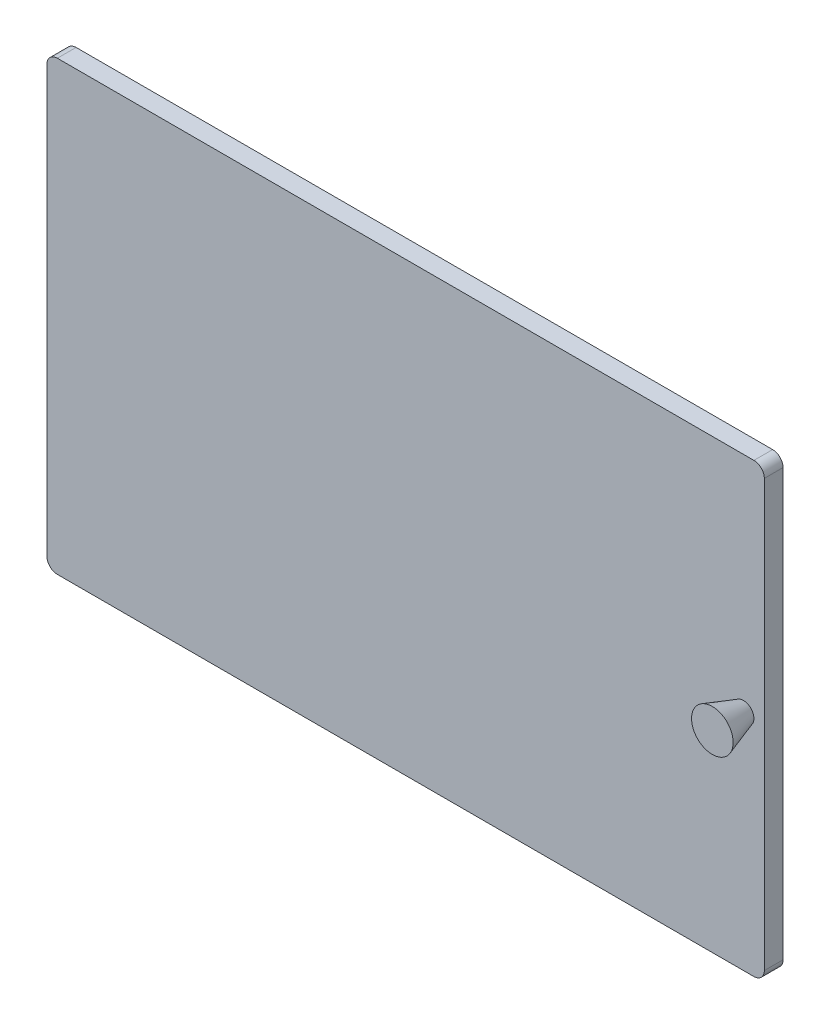
ISO-10303-21;
HEADER;
FILE_DESCRIPTION(('STEP AP214'),'2;1');
FILE_NAME('part.step','',(''),(''),'','','');
FILE_SCHEMA(('AUTOMOTIVE_DESIGN { 1 0 10303 214 1 1 1 1 }'));
ENDSEC;
DATA;
#1=APPLICATION_CONTEXT('core data for automotive mechanical design processes');
#2=APPLICATION_PROTOCOL_DEFINITION('international standard','automotive_design',2000,#1);
#3=PRODUCT_CONTEXT('',#1,'mechanical');
#4=PRODUCT('Part','Part','',(#3));
#5=PRODUCT_RELATED_PRODUCT_CATEGORY('part','',(#4));
#6=PRODUCT_DEFINITION_FORMATION('','',#4);
#7=PRODUCT_DEFINITION_CONTEXT('part definition',#1,'design');
#8=PRODUCT_DEFINITION('design','',#6,#7);
#9=PRODUCT_DEFINITION_SHAPE('','',#8);
#10=(LENGTH_UNIT() NAMED_UNIT(*) SI_UNIT(.MILLI.,.METRE.));
#11=(NAMED_UNIT(*) PLANE_ANGLE_UNIT() SI_UNIT($,.RADIAN.));
#12=(NAMED_UNIT(*) SI_UNIT($,.STERADIAN.) SOLID_ANGLE_UNIT());
#13=UNCERTAINTY_MEASURE_WITH_UNIT(LENGTH_MEASURE(1.E-05),#10,'distance_accuracy_value','');
#14=(GEOMETRIC_REPRESENTATION_CONTEXT(3) GLOBAL_UNCERTAINTY_ASSIGNED_CONTEXT((#13)) GLOBAL_UNIT_ASSIGNED_CONTEXT((#10,
#11,#12)) REPRESENTATION_CONTEXT('',''));
#15=CARTESIAN_POINT('',(0.,0.,0.));
#16=DIRECTION('',(0.,0.,1.));
#17=DIRECTION('',(1.,0.,0.));
#18=AXIS2_PLACEMENT_3D('',#15,#16,#17);
#19=CARTESIAN_POINT('',(33.5,-20.5,1.8));
#20=DIRECTION('',(0.,0.,-1.));
#21=DIRECTION('',(-1.,0.,0.));
#22=AXIS2_PLACEMENT_3D('',#19,#20,#21);
#23=CYLINDRICAL_SURFACE('',#22,1.);
#24=CARTESIAN_POINT('',(33.5,-20.5,0.));
#25=DIRECTION('',(0.,0.,1.));
#26=DIRECTION('',(1.,0.,0.));
#27=AXIS2_PLACEMENT_3D('',#24,#25,#26);
#28=CIRCLE('',#27,1.);
#29=CARTESIAN_POINT('',(33.5,-21.5,0.));
#30=VERTEX_POINT('',#29);
#31=CARTESIAN_POINT('',(34.5,-20.5,0.));
#32=VERTEX_POINT('',#31);
#33=EDGE_CURVE('E140',#30,#32,#28,.T.);
#34=ORIENTED_EDGE('',*,*,#33,.T.);
#35=DIRECTION('',(0.,0.,-1.));
#36=VECTOR('',#35,1.);
#37=CARTESIAN_POINT('',(34.5,-20.5,1.8));
#38=LINE('',#37,#36);
#39=CARTESIAN_POINT('',(34.5,-20.5,1.8));
#40=VERTEX_POINT('',#39);
#41=EDGE_CURVE('E11',#40,#32,#38,.T.);
#42=ORIENTED_EDGE('',*,*,#41,.F.);
#43=CARTESIAN_POINT('',(33.5,-20.5,1.8));
#44=DIRECTION('',(0.,0.,1.));
#45=DIRECTION('',(1.,0.,0.));
#46=AXIS2_PLACEMENT_3D('',#43,#44,#45);
#47=CIRCLE('',#46,1.);
#48=CARTESIAN_POINT('',(33.5,-21.5,1.8));
#49=VERTEX_POINT('',#48);
#50=EDGE_CURVE('E163',#49,#40,#47,.T.);
#51=ORIENTED_EDGE('',*,*,#50,.F.);
#52=DIRECTION('',(0.,0.,-1.));
#53=VECTOR('',#52,1.);
#54=CARTESIAN_POINT('',(33.5,-21.5,1.8));
#55=LINE('',#54,#53);
#56=EDGE_CURVE('E136',#49,#30,#55,.T.);
#57=ORIENTED_EDGE('',*,*,#56,.T.);
#58=EDGE_LOOP('',(#34,#42,#51,#57));
#59=FACE_BOUND('',#58,.T.);
#60=ADVANCED_FACE('F39',(#59),#23,.T.);
#61=CARTESIAN_POINT('',(34.5,-20.5,1.8));
#62=DIRECTION('',(-1.,0.,0.));
#63=DIRECTION('',(0.,0.,1.));
#64=AXIS2_PLACEMENT_3D('',#61,#62,#63);
#65=PLANE('',#64);
#66=DIRECTION('',(0.,1.,0.));
#67=VECTOR('',#66,1.);
#68=CARTESIAN_POINT('',(34.5,-20.5,0.));
#69=LINE('',#68,#67);
#70=CARTESIAN_POINT('',(34.5,20.5,0.));
#71=VERTEX_POINT('',#70);
#72=EDGE_CURVE('E144',#32,#71,#69,.T.);
#73=ORIENTED_EDGE('',*,*,#72,.T.);
#74=DIRECTION('',(0.,0.,-1.));
#75=VECTOR('',#74,1.);
#76=CARTESIAN_POINT('',(34.5,20.5,1.8));
#77=LINE('',#76,#75);
#78=CARTESIAN_POINT('',(34.5,20.5,1.8));
#79=VERTEX_POINT('',#78);
#80=EDGE_CURVE('E48',#79,#71,#77,.T.);
#81=ORIENTED_EDGE('',*,*,#80,.F.);
#82=DIRECTION('',(0.,1.,0.));
#83=VECTOR('',#82,1.);
#84=CARTESIAN_POINT('',(34.5,-20.5,1.8));
#85=LINE('',#84,#83);
#86=EDGE_CURVE('E99',#40,#79,#85,.T.);
#87=ORIENTED_EDGE('',*,*,#86,.F.);
#88=ORIENTED_EDGE('',*,*,#41,.T.);
#89=EDGE_LOOP('',(#73,#81,#87,#88));
#90=FACE_BOUND('',#89,.T.);
#91=ADVANCED_FACE('F228',(#90),#65,.F.);
#92=CARTESIAN_POINT('',(33.5,20.5,1.8));
#93=DIRECTION('',(0.,0.,-1.));
#94=DIRECTION('',(-1.,0.,0.));
#95=AXIS2_PLACEMENT_3D('',#92,#93,#94);
#96=CYLINDRICAL_SURFACE('',#95,1.);
#97=CARTESIAN_POINT('',(33.5,20.5,0.));
#98=DIRECTION('',(0.,0.,1.));
#99=DIRECTION('',(-1.,0.,0.));
#100=AXIS2_PLACEMENT_3D('',#97,#98,#99);
#101=CIRCLE('',#100,1.);
#102=CARTESIAN_POINT('',(33.5,21.5,0.));
#103=VERTEX_POINT('',#102);
#104=EDGE_CURVE('E148',#71,#103,#101,.T.);
#105=ORIENTED_EDGE('',*,*,#104,.T.);
#106=DIRECTION('',(0.,0.,-1.));
#107=VECTOR('',#106,1.);
#108=CARTESIAN_POINT('',(33.5,21.5,1.8));
#109=LINE('',#108,#107);
#110=CARTESIAN_POINT('',(33.5,21.5,1.8));
#111=VERTEX_POINT('',#110);
#112=EDGE_CURVE('E174',#111,#103,#109,.T.);
#113=ORIENTED_EDGE('',*,*,#112,.F.);
#114=CARTESIAN_POINT('',(33.5,20.5,1.8));
#115=DIRECTION('',(0.,0.,1.));
#116=DIRECTION('',(-1.,0.,0.));
#117=AXIS2_PLACEMENT_3D('',#114,#115,#116);
#118=CIRCLE('',#117,1.);
#119=EDGE_CURVE('E184',#79,#111,#118,.T.);
#120=ORIENTED_EDGE('',*,*,#119,.F.);
#121=ORIENTED_EDGE('',*,*,#80,.T.);
#122=EDGE_LOOP('',(#105,#113,#120,#121));
#123=FACE_BOUND('',#122,.T.);
#124=ADVANCED_FACE('F182',(#123),#96,.T.);
#125=CARTESIAN_POINT('',(-33.5,21.5,1.8));
#126=DIRECTION('',(0.,-1.,0.));
#127=DIRECTION('',(0.,0.,-1.));
#128=AXIS2_PLACEMENT_3D('',#125,#126,#127);
#129=PLANE('',#128);
#130=DIRECTION('',(-1.,0.,0.));
#131=VECTOR('',#130,1.);
#132=CARTESIAN_POINT('',(-33.5,21.5,0.));
#133=LINE('',#132,#131);
#134=CARTESIAN_POINT('',(-33.5,21.5,0.));
#135=VERTEX_POINT('',#134);
#136=EDGE_CURVE('E151',#103,#135,#133,.T.);
#137=ORIENTED_EDGE('',*,*,#136,.T.);
#138=DIRECTION('',(0.,0.,-1.));
#139=VECTOR('',#138,1.);
#140=CARTESIAN_POINT('',(-33.5,21.5,1.8));
#141=LINE('',#140,#139);
#142=CARTESIAN_POINT('',(-33.5,21.5,1.8));
#143=VERTEX_POINT('',#142);
#144=EDGE_CURVE('E170',#143,#135,#141,.T.);
#145=ORIENTED_EDGE('',*,*,#144,.F.);
#146=DIRECTION('',(-1.,0.,0.));
#147=VECTOR('',#146,1.);
#148=CARTESIAN_POINT('',(-33.5,21.5,1.8));
#149=LINE('',#148,#147);
#150=EDGE_CURVE('E197',#111,#143,#149,.T.);
#151=ORIENTED_EDGE('',*,*,#150,.F.);
#152=ORIENTED_EDGE('',*,*,#112,.T.);
#153=EDGE_LOOP('',(#137,#145,#151,#152));
#154=FACE_BOUND('',#153,.T.);
#155=ADVANCED_FACE('F192',(#154),#129,.F.);
#156=CARTESIAN_POINT('',(-33.5,20.5,1.8));
#157=DIRECTION('',(0.,0.,-1.));
#158=DIRECTION('',(-1.,0.,0.));
#159=AXIS2_PLACEMENT_3D('',#156,#157,#158);
#160=CYLINDRICAL_SURFACE('',#159,1.);
#161=CARTESIAN_POINT('',(-33.5,20.5,0.));
#162=DIRECTION('',(0.,0.,1.));
#163=DIRECTION('',(-1.,0.,0.));
#164=AXIS2_PLACEMENT_3D('',#161,#162,#163);
#165=CIRCLE('',#164,1.);
#166=CARTESIAN_POINT('',(-34.5,20.5,0.));
#167=VERTEX_POINT('',#166);
#168=EDGE_CURVE('E154',#135,#167,#165,.T.);
#169=ORIENTED_EDGE('',*,*,#168,.T.);
#170=DIRECTION('',(0.,0.,-1.));
#171=VECTOR('',#170,1.);
#172=CARTESIAN_POINT('',(-34.5,20.5,1.8));
#173=LINE('',#172,#171);
#174=CARTESIAN_POINT('',(-34.5,20.5,1.8));
#175=VERTEX_POINT('',#174);
#176=EDGE_CURVE('E129',#175,#167,#173,.T.);
#177=ORIENTED_EDGE('',*,*,#176,.F.);
#178=CARTESIAN_POINT('',(-33.5,20.5,1.8));
#179=DIRECTION('',(0.,0.,1.));
#180=DIRECTION('',(-1.,0.,0.));
#181=AXIS2_PLACEMENT_3D('',#178,#179,#180);
#182=CIRCLE('',#181,1.);
#183=EDGE_CURVE('E118',#143,#175,#182,.T.);
#184=ORIENTED_EDGE('',*,*,#183,.F.);
#185=ORIENTED_EDGE('',*,*,#144,.T.);
#186=EDGE_LOOP('',(#169,#177,#184,#185));
#187=FACE_BOUND('',#186,.T.);
#188=ADVANCED_FACE('F195',(#187),#160,.T.);
#189=CARTESIAN_POINT('',(-34.5,-20.5,1.8));
#190=DIRECTION('',(1.,0.,0.));
#191=DIRECTION('',(0.,0.,-1.));
#192=AXIS2_PLACEMENT_3D('',#189,#190,#191);
#193=PLANE('',#192);
#194=DIRECTION('',(0.,-1.,0.));
#195=VECTOR('',#194,1.);
#196=CARTESIAN_POINT('',(-34.5,-20.5,0.));
#197=LINE('',#196,#195);
#198=CARTESIAN_POINT('',(-34.5,-20.5,0.));
#199=VERTEX_POINT('',#198);
#200=EDGE_CURVE('E127',#167,#199,#197,.T.);
#201=ORIENTED_EDGE('',*,*,#200,.T.);
#202=DIRECTION('',(0.,0.,-1.));
#203=VECTOR('',#202,1.);
#204=CARTESIAN_POINT('',(-34.5,-20.5,1.8));
#205=LINE('',#204,#203);
#206=CARTESIAN_POINT('',(-34.5,-20.5,1.8));
#207=VERTEX_POINT('',#206);
#208=EDGE_CURVE('E124',#207,#199,#205,.T.);
#209=ORIENTED_EDGE('',*,*,#208,.F.);
#210=DIRECTION('',(0.,-1.,0.));
#211=VECTOR('',#210,1.);
#212=CARTESIAN_POINT('',(-34.5,-20.5,1.8));
#213=LINE('',#212,#211);
#214=EDGE_CURVE('E112',#175,#207,#213,.T.);
#215=ORIENTED_EDGE('',*,*,#214,.F.);
#216=ORIENTED_EDGE('',*,*,#176,.T.);
#217=EDGE_LOOP('',(#201,#209,#215,#216));
#218=FACE_BOUND('',#217,.T.);
#219=ADVANCED_FACE('F125',(#218),#193,.F.);
#220=CARTESIAN_POINT('',(-33.5,-20.5,1.8));
#221=DIRECTION('',(0.,0.,-1.));
#222=DIRECTION('',(-1.,0.,0.));
#223=AXIS2_PLACEMENT_3D('',#220,#221,#222);
#224=CYLINDRICAL_SURFACE('',#223,1.);
#225=CARTESIAN_POINT('',(-33.5,-20.5,0.));
#226=DIRECTION('',(0.,0.,1.));
#227=DIRECTION('',(-1.,0.,0.));
#228=AXIS2_PLACEMENT_3D('',#225,#226,#227);
#229=CIRCLE('',#228,1.);
#230=CARTESIAN_POINT('',(-33.5,-21.5,0.));
#231=VERTEX_POINT('',#230);
#232=EDGE_CURVE('E85',#199,#231,#229,.T.);
#233=ORIENTED_EDGE('',*,*,#232,.T.);
#234=DIRECTION('',(0.,0.,-1.));
#235=VECTOR('',#234,1.);
#236=CARTESIAN_POINT('',(-33.5,-21.5,1.8));
#237=LINE('',#236,#235);
#238=CARTESIAN_POINT('',(-33.5,-21.5,1.8));
#239=VERTEX_POINT('',#238);
#240=EDGE_CURVE('E130',#239,#231,#237,.T.);
#241=ORIENTED_EDGE('',*,*,#240,.F.);
#242=CARTESIAN_POINT('',(-33.5,-20.5,1.8));
#243=DIRECTION('',(0.,0.,1.));
#244=DIRECTION('',(-1.,0.,0.));
#245=AXIS2_PLACEMENT_3D('',#242,#243,#244);
#246=CIRCLE('',#245,1.);
#247=EDGE_CURVE('E116',#207,#239,#246,.T.);
#248=ORIENTED_EDGE('',*,*,#247,.F.);
#249=ORIENTED_EDGE('',*,*,#208,.T.);
#250=EDGE_LOOP('',(#233,#241,#248,#249));
#251=FACE_BOUND('',#250,.T.);
#252=ADVANCED_FACE('F132',(#251),#224,.T.);
#253=CARTESIAN_POINT('',(-33.5,-21.5,1.8));
#254=DIRECTION('',(0.,1.,0.));
#255=DIRECTION('',(0.,0.,1.));
#256=AXIS2_PLACEMENT_3D('',#253,#254,#255);
#257=PLANE('',#256);
#258=DIRECTION('',(1.,0.,0.));
#259=VECTOR('',#258,1.);
#260=CARTESIAN_POINT('',(-33.5,-21.5,0.));
#261=LINE('',#260,#259);
#262=EDGE_CURVE('E91',#231,#30,#261,.T.);
#263=ORIENTED_EDGE('',*,*,#262,.T.);
#264=ORIENTED_EDGE('',*,*,#56,.F.);
#265=DIRECTION('',(1.,0.,0.));
#266=VECTOR('',#265,1.);
#267=CARTESIAN_POINT('',(-33.5,-21.5,1.8));
#268=LINE('',#267,#266);
#269=EDGE_CURVE('E56',#239,#49,#268,.T.);
#270=ORIENTED_EDGE('',*,*,#269,.F.);
#271=ORIENTED_EDGE('',*,*,#240,.T.);
#272=EDGE_LOOP('',(#263,#264,#270,#271));
#273=FACE_BOUND('',#272,.T.);
#274=ADVANCED_FACE('F218',(#273),#257,.F.);
#275=CARTESIAN_POINT('',(33.5,-20.5,1.8));
#276=DIRECTION('',(0.,0.,1.));
#277=DIRECTION('',(1.,0.,0.));
#278=AXIS2_PLACEMENT_3D('',#275,#276,#277);
#279=PLANE('',#278);
#280=CARTESIAN_POINT('',(32.5,0.,1.8));
#281=DIRECTION('',(0.,0.,1.));
#282=DIRECTION('',(1.,0.,0.));
#283=AXIS2_PLACEMENT_3D('',#280,#281,#282);
#284=CIRCLE('',#283,0.999999999999998);
#285=CARTESIAN_POINT('',(33.5,0.,1.8));
#286=VERTEX_POINT('',#285);
#287=EDGE_CURVE('E210',#286,#286,#284,.T.);
#288=ORIENTED_EDGE('',*,*,#287,.F.);
#289=EDGE_LOOP('',(#288));
#290=FACE_BOUND('',#289,.T.);
#291=ORIENTED_EDGE('',*,*,#50,.T.);
#292=ORIENTED_EDGE('',*,*,#86,.T.);
#293=ORIENTED_EDGE('',*,*,#119,.T.);
#294=ORIENTED_EDGE('',*,*,#150,.T.);
#295=ORIENTED_EDGE('',*,*,#183,.T.);
#296=ORIENTED_EDGE('',*,*,#214,.T.);
#297=ORIENTED_EDGE('',*,*,#247,.T.);
#298=ORIENTED_EDGE('',*,*,#269,.T.);
#299=EDGE_LOOP('',(#291,#292,#293,#294,#295,#296,#297,#298));
#300=FACE_BOUND('',#299,.T.);
#301=ADVANCED_FACE('F114',(#290,#300),#279,.T.);
#302=CARTESIAN_POINT('',(33.5,-20.5,0.));
#303=DIRECTION('',(0.,0.,1.));
#304=DIRECTION('',(1.,0.,0.));
#305=AXIS2_PLACEMENT_3D('',#302,#303,#304);
#306=PLANE('',#305);
#307=ORIENTED_EDGE('',*,*,#33,.F.);
#308=ORIENTED_EDGE('',*,*,#262,.F.);
#309=ORIENTED_EDGE('',*,*,#232,.F.);
#310=ORIENTED_EDGE('',*,*,#200,.F.);
#311=ORIENTED_EDGE('',*,*,#168,.F.);
#312=ORIENTED_EDGE('',*,*,#136,.F.);
#313=ORIENTED_EDGE('',*,*,#104,.F.);
#314=ORIENTED_EDGE('',*,*,#72,.F.);
#315=EDGE_LOOP('',(#307,#308,#309,#310,#311,#312,#313,#314));
#316=FACE_BOUND('',#315,.T.);
#317=ADVANCED_FACE('F188',(#316),#306,.F.);
#318=CARTESIAN_POINT('',(32.5,0.,1.8));
#319=DIRECTION('',(0.,0.,1.));
#320=DIRECTION('',(1.,0.,0.));
#321=AXIS2_PLACEMENT_3D('',#318,#319,#320);
#322=CONICAL_SURFACE('',#321,0.999999999999998,0.321733994312635);
#323=CARTESIAN_POINT('',(32.5,0.,4.8));
#324=DIRECTION('',(0.,0.,1.));
#325=DIRECTION('',(1.,0.,0.));
#326=AXIS2_PLACEMENT_3D('',#323,#324,#325);
#327=CIRCLE('',#326,1.99994480002468);
#328=CARTESIAN_POINT('',(34.4999448000247,0.,4.8));
#329=VERTEX_POINT('',#328);
#330=EDGE_CURVE('E145',#329,#329,#327,.T.);
#331=ORIENTED_EDGE('',*,*,#330,.F.);
#332=EDGE_LOOP('',(#331));
#333=FACE_BOUND('',#332,.T.);
#334=ORIENTED_EDGE('',*,*,#287,.T.);
#335=EDGE_LOOP('',(#334));
#336=FACE_BOUND('',#335,.T.);
#337=ADVANCED_FACE('F215',(#333,#336),#322,.T.);
#338=CARTESIAN_POINT('',(32.5,0.,4.8));
#339=DIRECTION('',(0.,0.,1.));
#340=DIRECTION('',(1.,0.,0.));
#341=AXIS2_PLACEMENT_3D('',#338,#339,#340);
#342=PLANE('',#341);
#343=ORIENTED_EDGE('',*,*,#330,.T.);
#344=EDGE_LOOP('',(#343));
#345=FACE_BOUND('',#344,.T.);
#346=ADVANCED_FACE('F274',(#345),#342,.T.);
#347=CLOSED_SHELL('',(#60,#91,#124,#155,#188,#219,#252,#274,#301,#317,#337,#346));
#348=MANIFOLD_SOLID_BREP('B2',#347);
#349=ADVANCED_BREP_SHAPE_REPRESENTATION('',(#18,#348),#14);
#350=SHAPE_DEFINITION_REPRESENTATION(#9,#349);
ENDSEC;
END-ISO-10303-21;
